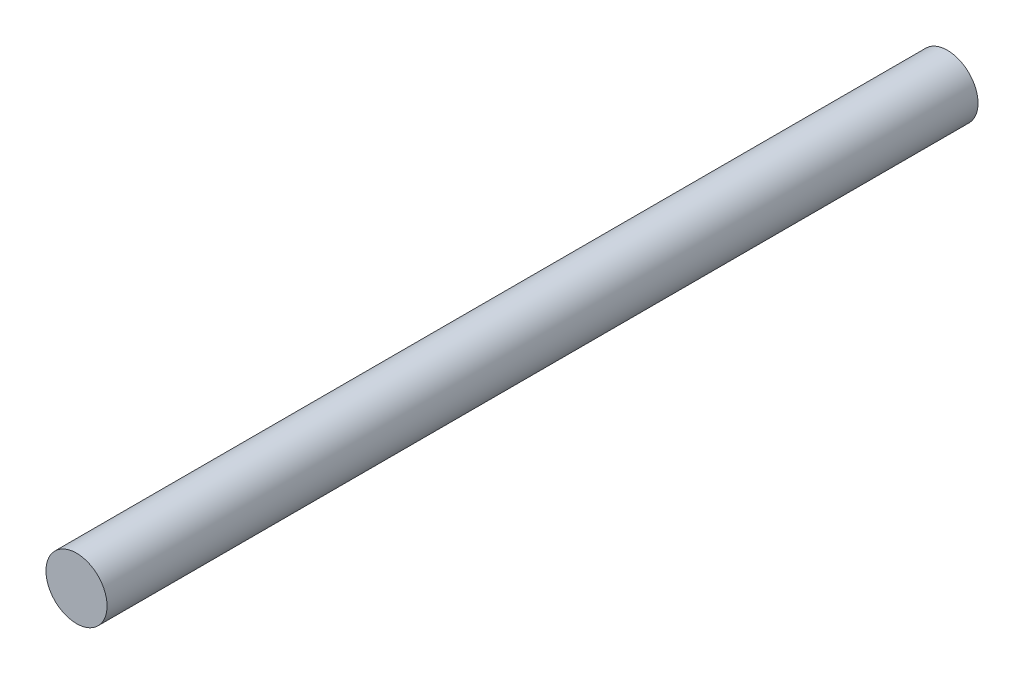
ISO-10303-21;
HEADER;
FILE_DESCRIPTION(('STEP AP214'),'2;1');
FILE_NAME('part.step','',(''),(''),'','','');
FILE_SCHEMA(('AUTOMOTIVE_DESIGN { 1 0 10303 214 1 1 1 1 }'));
ENDSEC;
DATA;
#1=APPLICATION_CONTEXT('core data for automotive mechanical design processes');
#2=APPLICATION_PROTOCOL_DEFINITION('international standard','automotive_design',2000,#1);
#3=PRODUCT_CONTEXT('',#1,'mechanical');
#4=PRODUCT('Part','Part','',(#3));
#5=PRODUCT_RELATED_PRODUCT_CATEGORY('part','',(#4));
#6=PRODUCT_DEFINITION_FORMATION('','',#4);
#7=PRODUCT_DEFINITION_CONTEXT('part definition',#1,'design');
#8=PRODUCT_DEFINITION('design','',#6,#7);
#9=PRODUCT_DEFINITION_SHAPE('','',#8);
#10=(LENGTH_UNIT() NAMED_UNIT(*) SI_UNIT(.MILLI.,.METRE.));
#11=(NAMED_UNIT(*) PLANE_ANGLE_UNIT() SI_UNIT($,.RADIAN.));
#12=(NAMED_UNIT(*) SI_UNIT($,.STERADIAN.) SOLID_ANGLE_UNIT());
#13=UNCERTAINTY_MEASURE_WITH_UNIT(LENGTH_MEASURE(1.E-05),#10,'distance_accuracy_value','');
#14=(GEOMETRIC_REPRESENTATION_CONTEXT(3) GLOBAL_UNCERTAINTY_ASSIGNED_CONTEXT((#13)) GLOBAL_UNIT_ASSIGNED_CONTEXT((#10,
#11,#12)) REPRESENTATION_CONTEXT('',''));
#15=CARTESIAN_POINT('',(0.,0.,0.));
#16=DIRECTION('',(0.,0.,1.));
#17=DIRECTION('',(1.,0.,0.));
#18=AXIS2_PLACEMENT_3D('',#15,#16,#17);
#19=CARTESIAN_POINT('',(0.,0.,72.39));
#20=DIRECTION('',(0.,0.,-1.));
#21=DIRECTION('',(-1.,0.,0.));
#22=AXIS2_PLACEMENT_3D('',#19,#20,#21);
#23=CYLINDRICAL_SURFACE('',#22,2.54);
#24=CARTESIAN_POINT('',(0.,0.,72.39));
#25=DIRECTION('',(0.,0.,1.));
#26=DIRECTION('',(1.,0.,0.));
#27=AXIS2_PLACEMENT_3D('',#24,#25,#26);
#28=CIRCLE('',#27,2.54);
#29=CARTESIAN_POINT('',(2.54,0.,72.39));
#30=VERTEX_POINT('',#29);
#31=EDGE_CURVE('E10',#30,#30,#28,.T.);
#32=ORIENTED_EDGE('',*,*,#31,.F.);
#33=EDGE_LOOP('',(#32));
#34=FACE_BOUND('',#33,.T.);
#35=CARTESIAN_POINT('',(0.,0.,0.));
#36=DIRECTION('',(0.,0.,1.));
#37=DIRECTION('',(1.,0.,0.));
#38=AXIS2_PLACEMENT_3D('',#35,#36,#37);
#39=CIRCLE('',#38,2.54);
#40=CARTESIAN_POINT('',(2.54,0.,0.));
#41=VERTEX_POINT('',#40);
#42=EDGE_CURVE('E40',#41,#41,#39,.T.);
#43=ORIENTED_EDGE('',*,*,#42,.T.);
#44=EDGE_LOOP('',(#43));
#45=FACE_BOUND('',#44,.T.);
#46=ADVANCED_FACE('F37',(#34,#45),#23,.T.);
#47=CARTESIAN_POINT('',(0.,0.,72.39));
#48=DIRECTION('',(0.,0.,1.));
#49=DIRECTION('',(1.,0.,0.));
#50=AXIS2_PLACEMENT_3D('',#47,#48,#49);
#51=PLANE('',#50);
#52=ORIENTED_EDGE('',*,*,#31,.T.);
#53=EDGE_LOOP('',(#52));
#54=FACE_BOUND('',#53,.T.);
#55=ADVANCED_FACE('F54',(#54),#51,.T.);
#56=CARTESIAN_POINT('',(0.,0.,0.));
#57=DIRECTION('',(0.,0.,1.));
#58=DIRECTION('',(1.,0.,0.));
#59=AXIS2_PLACEMENT_3D('',#56,#57,#58);
#60=PLANE('',#59);
#61=ORIENTED_EDGE('',*,*,#42,.F.);
#62=EDGE_LOOP('',(#61));
#63=FACE_BOUND('',#62,.T.);
#64=ADVANCED_FACE('F52',(#63),#60,.F.);
#65=CLOSED_SHELL('',(#46,#55,#64));
#66=MANIFOLD_SOLID_BREP('B2',#65);
#67=ADVANCED_BREP_SHAPE_REPRESENTATION('',(#18,#66),#14);
#68=SHAPE_DEFINITION_REPRESENTATION(#9,#67);
ENDSEC;
END-ISO-10303-21;
